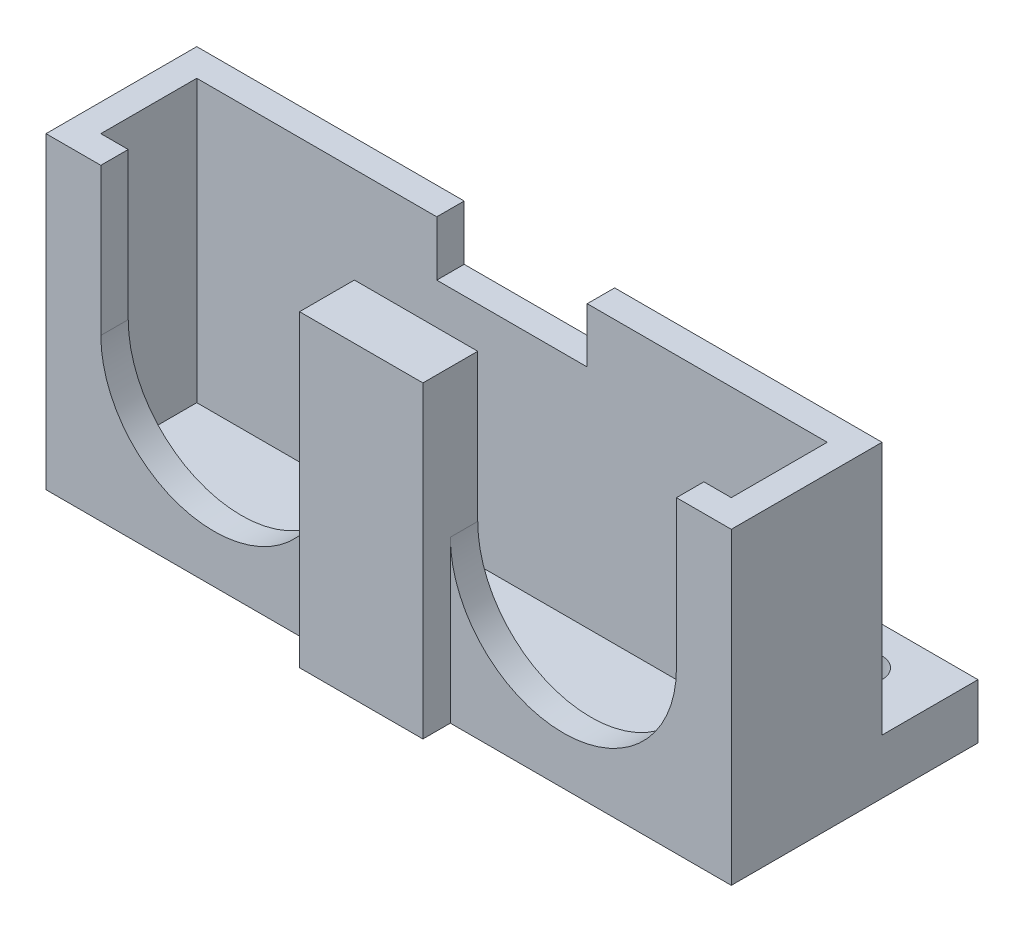
ISO-10303-21;
HEADER;
FILE_DESCRIPTION(('STEP AP214'),'2;1');
FILE_NAME('part.step','',(''),(''),'','','');
FILE_SCHEMA(('AUTOMOTIVE_DESIGN { 1 0 10303 214 1 1 1 1 }'));
ENDSEC;
DATA;
#1=APPLICATION_CONTEXT('core data for automotive mechanical design processes');
#2=APPLICATION_PROTOCOL_DEFINITION('international standard','automotive_design',2000,#1);
#3=PRODUCT_CONTEXT('',#1,'mechanical');
#4=PRODUCT('Part','Part','',(#3));
#5=PRODUCT_RELATED_PRODUCT_CATEGORY('part','',(#4));
#6=PRODUCT_DEFINITION_FORMATION('','',#4);
#7=PRODUCT_DEFINITION_CONTEXT('part definition',#1,'design');
#8=PRODUCT_DEFINITION('design','',#6,#7);
#9=PRODUCT_DEFINITION_SHAPE('','',#8);
#10=(LENGTH_UNIT() NAMED_UNIT(*) SI_UNIT(.MILLI.,.METRE.));
#11=(NAMED_UNIT(*) PLANE_ANGLE_UNIT() SI_UNIT($,.RADIAN.));
#12=(NAMED_UNIT(*) SI_UNIT($,.STERADIAN.) SOLID_ANGLE_UNIT());
#13=UNCERTAINTY_MEASURE_WITH_UNIT(LENGTH_MEASURE(1.E-05),#10,'distance_accuracy_value','');
#14=(GEOMETRIC_REPRESENTATION_CONTEXT(3) GLOBAL_UNCERTAINTY_ASSIGNED_CONTEXT((#13)) GLOBAL_UNIT_ASSIGNED_CONTEXT((#10,
#11,#12)) REPRESENTATION_CONTEXT('',''));
#15=CARTESIAN_POINT('',(0.,0.,0.));
#16=DIRECTION('',(0.,0.,1.));
#17=DIRECTION('',(1.,0.,0.));
#18=AXIS2_PLACEMENT_3D('',#15,#16,#17);
#19=CARTESIAN_POINT('',(-25.,22.5,5.50000000000001));
#20=DIRECTION('',(0.,0.,-1.));
#21=DIRECTION('',(-1.,0.,0.));
#22=AXIS2_PLACEMENT_3D('',#19,#20,#21);
#23=PLANE('',#22);
#24=DIRECTION('',(1.,0.,0.));
#25=VECTOR('',#24,1.);
#26=CARTESIAN_POINT('',(-25.,0.,5.50000000000001));
#27=LINE('',#26,#25);
#28=CARTESIAN_POINT('',(-25.,0.,5.50000000000001));
#29=VERTEX_POINT('',#28);
#30=CARTESIAN_POINT('',(-4.50000000000001,0.,5.50000000000001));
#31=VERTEX_POINT('',#30);
#32=EDGE_CURVE('E422',#29,#31,#27,.T.);
#33=ORIENTED_EDGE('',*,*,#32,.T.);
#34=DIRECTION('',(0.,1.,0.));
#35=VECTOR('',#34,1.);
#36=CARTESIAN_POINT('',(-4.50000000000002,22.5,5.50000000000001));
#37=LINE('',#36,#35);
#38=CARTESIAN_POINT('',(-4.50000000000002,11.75,5.50000000000001));
#39=VERTEX_POINT('',#38);
#40=EDGE_CURVE('E216',#31,#39,#37,.T.);
#41=ORIENTED_EDGE('',*,*,#40,.T.);
#42=CARTESIAN_POINT('',(-12.75,11.75,5.50000000000001));
#43=DIRECTION('',(0.,0.,1.));
#44=DIRECTION('',(1.,0.,0.));
#45=AXIS2_PLACEMENT_3D('',#42,#43,#44);
#46=CIRCLE('',#45,8.25);
#47=CARTESIAN_POINT('',(-21.,11.75,5.50000000000001));
#48=VERTEX_POINT('',#47);
#49=EDGE_CURVE('E345',#48,#39,#46,.T.);
#50=ORIENTED_EDGE('',*,*,#49,.F.);
#51=DIRECTION('',(0.,-1.,0.));
#52=VECTOR('',#51,1.);
#53=CARTESIAN_POINT('',(-21.,22.5,5.50000000000001));
#54=LINE('',#53,#52);
#55=CARTESIAN_POINT('',(-21.,22.5,5.50000000000001));
#56=VERTEX_POINT('',#55);
#57=EDGE_CURVE('E339',#56,#48,#54,.T.);
#58=ORIENTED_EDGE('',*,*,#57,.F.);
#59=DIRECTION('',(1.,0.,0.));
#60=VECTOR('',#59,1.);
#61=CARTESIAN_POINT('',(-25.,22.5,5.50000000000001));
#62=LINE('',#61,#60);
#63=CARTESIAN_POINT('',(-25.,22.5,5.50000000000001));
#64=VERTEX_POINT('',#63);
#65=EDGE_CURVE('E429',#64,#56,#62,.T.);
#66=ORIENTED_EDGE('',*,*,#65,.F.);
#67=DIRECTION('',(0.,-1.,0.));
#68=VECTOR('',#67,1.);
#69=CARTESIAN_POINT('',(-25.,22.5,5.50000000000001));
#70=LINE('',#69,#68);
#71=EDGE_CURVE('E440',#64,#29,#70,.T.);
#72=ORIENTED_EDGE('',*,*,#71,.T.);
#73=EDGE_LOOP('',(#33,#41,#50,#58,#66,#72));
#74=FACE_BOUND('',#73,.T.);
#75=ADVANCED_FACE('F46',(#74),#23,.F.);
#76=CARTESIAN_POINT('',(-25.,22.5,-5.5));
#77=DIRECTION('',(0.,0.,1.));
#78=DIRECTION('',(1.,0.,0.));
#79=AXIS2_PLACEMENT_3D('',#76,#77,#78);
#80=PLANE('',#79);
#81=DIRECTION('',(1.,0.,0.));
#82=VECTOR('',#81,1.);
#83=CARTESIAN_POINT('',(25.,4.,-5.50000000000001));
#84=LINE('',#83,#82);
#85=CARTESIAN_POINT('',(-25.,4.00000000000001,-5.5));
#86=VERTEX_POINT('',#85);
#87=CARTESIAN_POINT('',(25.,4.,-5.50000000000001));
#88=VERTEX_POINT('',#87);
#89=EDGE_CURVE('E63',#86,#88,#84,.T.);
#90=ORIENTED_EDGE('',*,*,#89,.F.);
#91=DIRECTION('',(0.,-1.,0.));
#92=VECTOR('',#91,1.);
#93=CARTESIAN_POINT('',(-25.,22.5,-5.5));
#94=LINE('',#93,#92);
#95=CARTESIAN_POINT('',(-25.,22.5,-5.5));
#96=VERTEX_POINT('',#95);
#97=EDGE_CURVE('E317',#96,#86,#94,.T.);
#98=ORIENTED_EDGE('',*,*,#97,.F.);
#99=DIRECTION('',(-1.,0.,0.));
#100=VECTOR('',#99,1.);
#101=CARTESIAN_POINT('',(-25.,22.5,-5.5));
#102=LINE('',#101,#100);
#103=CARTESIAN_POINT('',(-5.48958028460994,22.5,-5.5));
#104=VERTEX_POINT('',#103);
#105=EDGE_CURVE('E421',#104,#96,#102,.T.);
#106=ORIENTED_EDGE('',*,*,#105,.F.);
#107=DIRECTION('',(0.,1.,0.));
#108=VECTOR('',#107,1.);
#109=CARTESIAN_POINT('',(-5.48958028460994,18.5,-5.5));
#110=LINE('',#109,#108);
#111=CARTESIAN_POINT('',(-5.48958028460994,18.5,-5.5));
#112=VERTEX_POINT('',#111);
#113=EDGE_CURVE('E378',#112,#104,#110,.T.);
#114=ORIENTED_EDGE('',*,*,#113,.F.);
#115=DIRECTION('',(-1.,0.,0.));
#116=VECTOR('',#115,1.);
#117=CARTESIAN_POINT('',(-5.48958028460994,18.5,-5.5));
#118=LINE('',#117,#116);
#119=CARTESIAN_POINT('',(5.48958028460994,18.5,-5.5));
#120=VERTEX_POINT('',#119);
#121=EDGE_CURVE('E360',#120,#112,#118,.T.);
#122=ORIENTED_EDGE('',*,*,#121,.F.);
#123=DIRECTION('',(0.,1.,0.));
#124=VECTOR('',#123,1.);
#125=CARTESIAN_POINT('',(5.48958028460994,18.5,-5.5));
#126=LINE('',#125,#124);
#127=CARTESIAN_POINT('',(5.48958028460994,22.5,-5.5));
#128=VERTEX_POINT('',#127);
#129=EDGE_CURVE('E369',#120,#128,#126,.T.);
#130=ORIENTED_EDGE('',*,*,#129,.T.);
#131=CARTESIAN_POINT('',(25.,22.5,-5.50000000000001));
#132=VERTEX_POINT('',#131);
#133=EDGE_CURVE('E423',#132,#128,#102,.T.);
#134=ORIENTED_EDGE('',*,*,#133,.F.);
#135=DIRECTION('',(0.,-1.,0.));
#136=VECTOR('',#135,1.);
#137=CARTESIAN_POINT('',(25.,22.5,-5.50000000000001));
#138=LINE('',#137,#136);
#139=EDGE_CURVE('E448',#132,#88,#138,.T.);
#140=ORIENTED_EDGE('',*,*,#139,.T.);
#141=EDGE_LOOP('',(#90,#98,#106,#114,#122,#130,#134,#140));
#142=FACE_BOUND('',#141,.T.);
#143=ADVANCED_FACE('F539',(#142),#80,.F.);
#144=CARTESIAN_POINT('',(0.,22.5,0.));
#145=DIRECTION('',(0.,1.,0.));
#146=DIRECTION('',(0.,0.,1.));
#147=AXIS2_PLACEMENT_3D('',#144,#145,#146);
#148=PLANE('',#147);
#149=DIRECTION('',(0.,0.,1.));
#150=VECTOR('',#149,1.);
#151=CARTESIAN_POINT('',(4.49999999999999,22.5,1.5));
#152=LINE('',#151,#150);
#153=CARTESIAN_POINT('',(4.49999999999999,22.5,3.5));
#154=VERTEX_POINT('',#153);
#155=CARTESIAN_POINT('',(4.49999999999999,22.5,7.5));
#156=VERTEX_POINT('',#155);
#157=EDGE_CURVE('E337',#154,#156,#152,.T.);
#158=ORIENTED_EDGE('',*,*,#157,.F.);
#159=DIRECTION('',(1.,0.,0.));
#160=VECTOR('',#159,1.);
#161=CARTESIAN_POINT('',(-23.,22.5,3.5));
#162=LINE('',#161,#160);
#163=CARTESIAN_POINT('',(-4.50000000000001,22.5,3.5));
#164=VERTEX_POINT('',#163);
#165=EDGE_CURVE('E406',#164,#154,#162,.T.);
#166=ORIENTED_EDGE('',*,*,#165,.F.);
#167=DIRECTION('',(0.,0.,1.));
#168=VECTOR('',#167,1.);
#169=CARTESIAN_POINT('',(-4.50000000000001,22.5,1.5));
#170=LINE('',#169,#168);
#171=CARTESIAN_POINT('',(-4.50000000000001,22.5,7.5));
#172=VERTEX_POINT('',#171);
#173=EDGE_CURVE('E352',#164,#172,#170,.T.);
#174=ORIENTED_EDGE('',*,*,#173,.T.);
#175=DIRECTION('',(1.,0.,0.));
#176=VECTOR('',#175,1.);
#177=CARTESIAN_POINT('',(-4.50000000000001,22.5,7.5));
#178=LINE('',#177,#176);
#179=EDGE_CURVE('E222',#172,#156,#178,.T.);
#180=ORIENTED_EDGE('',*,*,#179,.T.);
#181=EDGE_LOOP('',(#158,#166,#174,#180));
#182=FACE_BOUND('',#181,.T.);
#183=ADVANCED_FACE('F478',(#182),#148,.T.);
#184=DIRECTION('',(0.,0.,1.));
#185=VECTOR('',#184,1.);
#186=CARTESIAN_POINT('',(-21.,22.5,1.5));
#187=LINE('',#186,#185);
#188=CARTESIAN_POINT('',(-21.,22.5,3.5));
#189=VERTEX_POINT('',#188);
#190=EDGE_CURVE('E349',#189,#56,#187,.T.);
#191=ORIENTED_EDGE('',*,*,#190,.F.);
#192=CARTESIAN_POINT('',(-23.,22.5,3.5));
#193=VERTEX_POINT('',#192);
#194=EDGE_CURVE('E386',#193,#189,#162,.T.);
#195=ORIENTED_EDGE('',*,*,#194,.F.);
#196=DIRECTION('',(0.,0.,1.));
#197=VECTOR('',#196,1.);
#198=CARTESIAN_POINT('',(-23.,22.5,-3.5));
#199=LINE('',#198,#197);
#200=CARTESIAN_POINT('',(-23.,22.5,-3.5));
#201=VERTEX_POINT('',#200);
#202=EDGE_CURVE('E400',#201,#193,#199,.T.);
#203=ORIENTED_EDGE('',*,*,#202,.F.);
#204=DIRECTION('',(-1.,0.,0.));
#205=VECTOR('',#204,1.);
#206=CARTESIAN_POINT('',(-23.,22.5,-3.5));
#207=LINE('',#206,#205);
#208=CARTESIAN_POINT('',(-5.48958028460994,22.5,-3.5));
#209=VERTEX_POINT('',#208);
#210=EDGE_CURVE('E396',#209,#201,#207,.T.);
#211=ORIENTED_EDGE('',*,*,#210,.F.);
#212=DIRECTION('',(0.,0.,1.));
#213=VECTOR('',#212,1.);
#214=CARTESIAN_POINT('',(-5.48958028460994,22.5,-5.5));
#215=LINE('',#214,#213);
#216=EDGE_CURVE('E361',#104,#209,#215,.T.);
#217=ORIENTED_EDGE('',*,*,#216,.F.);
#218=ORIENTED_EDGE('',*,*,#105,.T.);
#219=DIRECTION('',(0.,0.,1.));
#220=VECTOR('',#219,1.);
#221=CARTESIAN_POINT('',(-25.,22.5,-5.5));
#222=LINE('',#221,#220);
#223=EDGE_CURVE('E426',#96,#64,#222,.T.);
#224=ORIENTED_EDGE('',*,*,#223,.T.);
#225=ORIENTED_EDGE('',*,*,#65,.T.);
#226=EDGE_LOOP('',(#191,#195,#203,#211,#217,#218,#224,#225));
#227=FACE_BOUND('',#226,.T.);
#228=ADVANCED_FACE('F503',(#227),#148,.T.);
#229=CARTESIAN_POINT('',(25.,22.5,-5.50000000000001));
#230=DIRECTION('',(-1.,0.,0.));
#231=DIRECTION('',(0.,0.,1.));
#232=AXIS2_PLACEMENT_3D('',#229,#230,#231);
#233=PLANE('',#232);
#234=DIRECTION('',(0.,0.,-1.));
#235=VECTOR('',#234,1.);
#236=CARTESIAN_POINT('',(25.,0.,-5.50000000000001));
#237=LINE('',#236,#235);
#238=CARTESIAN_POINT('',(25.,0.,5.50000000000001));
#239=VERTEX_POINT('',#238);
#240=CARTESIAN_POINT('',(25.,0.,-12.5));
#241=VERTEX_POINT('',#240);
#242=EDGE_CURVE('E410',#239,#241,#237,.T.);
#243=ORIENTED_EDGE('',*,*,#242,.T.);
#244=DIRECTION('',(0.,-1.,0.));
#245=VECTOR('',#244,1.);
#246=CARTESIAN_POINT('',(25.,0.,-12.5));
#247=LINE('',#246,#245);
#248=CARTESIAN_POINT('',(25.,4.,-12.5));
#249=VERTEX_POINT('',#248);
#250=EDGE_CURVE('E299',#249,#241,#247,.T.);
#251=ORIENTED_EDGE('',*,*,#250,.F.);
#252=DIRECTION('',(0.,0.,1.));
#253=VECTOR('',#252,1.);
#254=CARTESIAN_POINT('',(25.,4.,-12.5));
#255=LINE('',#254,#253);
#256=EDGE_CURVE('E309',#249,#88,#255,.T.);
#257=ORIENTED_EDGE('',*,*,#256,.T.);
#258=ORIENTED_EDGE('',*,*,#139,.F.);
#259=DIRECTION('',(0.,0.,-1.));
#260=VECTOR('',#259,1.);
#261=CARTESIAN_POINT('',(25.,22.5,-5.50000000000001));
#262=LINE('',#261,#260);
#263=CARTESIAN_POINT('',(25.,22.5,5.50000000000001));
#264=VERTEX_POINT('',#263);
#265=EDGE_CURVE('E418',#264,#132,#262,.T.);
#266=ORIENTED_EDGE('',*,*,#265,.F.);
#267=DIRECTION('',(0.,-1.,0.));
#268=VECTOR('',#267,1.);
#269=CARTESIAN_POINT('',(25.,22.5,5.50000000000001));
#270=LINE('',#269,#268);
#271=EDGE_CURVE('E432',#264,#239,#270,.T.);
#272=ORIENTED_EDGE('',*,*,#271,.T.);
#273=EDGE_LOOP('',(#243,#251,#257,#258,#266,#272));
#274=FACE_BOUND('',#273,.T.);
#275=ADVANCED_FACE('F48',(#274),#233,.F.);
#276=CARTESIAN_POINT('',(-25.,22.5,-5.5));
#277=DIRECTION('',(1.,0.,0.));
#278=DIRECTION('',(0.,0.,-1.));
#279=AXIS2_PLACEMENT_3D('',#276,#277,#278);
#280=PLANE('',#279);
#281=DIRECTION('',(0.,0.,1.));
#282=VECTOR('',#281,1.);
#283=CARTESIAN_POINT('',(-25.,0.,-5.5));
#284=LINE('',#283,#282);
#285=CARTESIAN_POINT('',(-25.,0.,-12.5));
#286=VERTEX_POINT('',#285);
#287=EDGE_CURVE('E434',#286,#29,#284,.T.);
#288=ORIENTED_EDGE('',*,*,#287,.T.);
#289=ORIENTED_EDGE('',*,*,#71,.F.);
#290=ORIENTED_EDGE('',*,*,#223,.F.);
#291=ORIENTED_EDGE('',*,*,#97,.T.);
#292=DIRECTION('',(0.,0.,1.));
#293=VECTOR('',#292,1.);
#294=CARTESIAN_POINT('',(-25.,4.,-12.5));
#295=LINE('',#294,#293);
#296=CARTESIAN_POINT('',(-25.,4.,-12.5));
#297=VERTEX_POINT('',#296);
#298=EDGE_CURVE('E322',#297,#86,#295,.T.);
#299=ORIENTED_EDGE('',*,*,#298,.F.);
#300=DIRECTION('',(0.,1.,0.));
#301=VECTOR('',#300,1.);
#302=CARTESIAN_POINT('',(-25.,0.,-12.5));
#303=LINE('',#302,#301);
#304=EDGE_CURVE('E305',#286,#297,#303,.T.);
#305=ORIENTED_EDGE('',*,*,#304,.F.);
#306=EDGE_LOOP('',(#288,#289,#290,#291,#299,#305));
#307=FACE_BOUND('',#306,.T.);
#308=ADVANCED_FACE('F513',(#307),#280,.F.);
#309=CARTESIAN_POINT('',(12.75,11.75,5.50000000000001));
#310=DIRECTION('',(0.,0.,1.));
#311=DIRECTION('',(1.,0.,0.));
#312=AXIS2_PLACEMENT_3D('',#309,#310,#311);
#313=CIRCLE('',#312,8.25);
#314=CARTESIAN_POINT('',(4.49999999999999,11.75,5.50000000000001));
#315=VERTEX_POINT('',#314);
#316=CARTESIAN_POINT('',(21.,11.75,5.50000000000001));
#317=VERTEX_POINT('',#316);
#318=EDGE_CURVE('E312',#315,#317,#313,.T.);
#319=ORIENTED_EDGE('',*,*,#318,.F.);
#320=DIRECTION('',(0.,-1.,0.));
#321=VECTOR('',#320,1.);
#322=CARTESIAN_POINT('',(4.49999999999999,22.5,5.50000000000001));
#323=LINE('',#322,#321);
#324=CARTESIAN_POINT('',(4.49999999999999,0.,5.50000000000001));
#325=VERTEX_POINT('',#324);
#326=EDGE_CURVE('E240',#315,#325,#323,.T.);
#327=ORIENTED_EDGE('',*,*,#326,.T.);
#328=EDGE_CURVE('E436',#325,#239,#27,.T.);
#329=ORIENTED_EDGE('',*,*,#328,.T.);
#330=ORIENTED_EDGE('',*,*,#271,.F.);
#331=CARTESIAN_POINT('',(21.,22.5,5.50000000000001));
#332=VERTEX_POINT('',#331);
#333=EDGE_CURVE('E428',#332,#264,#62,.T.);
#334=ORIENTED_EDGE('',*,*,#333,.F.);
#335=DIRECTION('',(0.,1.,0.));
#336=VECTOR('',#335,1.);
#337=CARTESIAN_POINT('',(21.,22.5,5.50000000000001));
#338=LINE('',#337,#336);
#339=EDGE_CURVE('E328',#317,#332,#338,.T.);
#340=ORIENTED_EDGE('',*,*,#339,.F.);
#341=EDGE_LOOP('',(#319,#327,#329,#330,#334,#340));
#342=FACE_BOUND('',#341,.T.);
#343=ADVANCED_FACE('F521',(#342),#23,.F.);
#344=DIRECTION('',(0.,0.,1.));
#345=VECTOR('',#344,1.);
#346=CARTESIAN_POINT('',(21.,22.5,1.5));
#347=LINE('',#346,#345);
#348=CARTESIAN_POINT('',(21.,22.5,3.5));
#349=VERTEX_POINT('',#348);
#350=EDGE_CURVE('E340',#349,#332,#347,.T.);
#351=ORIENTED_EDGE('',*,*,#350,.T.);
#352=ORIENTED_EDGE('',*,*,#333,.T.);
#353=ORIENTED_EDGE('',*,*,#265,.T.);
#354=ORIENTED_EDGE('',*,*,#133,.T.);
#355=DIRECTION('',(0.,0.,-1.));
#356=VECTOR('',#355,1.);
#357=CARTESIAN_POINT('',(5.48958028460994,22.5,-5.5));
#358=LINE('',#357,#356);
#359=CARTESIAN_POINT('',(5.48958028460994,22.5,-3.5));
#360=VERTEX_POINT('',#359);
#361=EDGE_CURVE('E351',#360,#128,#358,.T.);
#362=ORIENTED_EDGE('',*,*,#361,.F.);
#363=CARTESIAN_POINT('',(23.,22.5,-3.5));
#364=VERTEX_POINT('',#363);
#365=EDGE_CURVE('E397',#364,#360,#207,.T.);
#366=ORIENTED_EDGE('',*,*,#365,.F.);
#367=DIRECTION('',(0.,0.,-1.));
#368=VECTOR('',#367,1.);
#369=CARTESIAN_POINT('',(23.,22.5,-3.5));
#370=LINE('',#369,#368);
#371=CARTESIAN_POINT('',(23.,22.5,3.5));
#372=VERTEX_POINT('',#371);
#373=EDGE_CURVE('E374',#372,#364,#370,.T.);
#374=ORIENTED_EDGE('',*,*,#373,.F.);
#375=EDGE_CURVE('E403',#349,#372,#162,.T.);
#376=ORIENTED_EDGE('',*,*,#375,.F.);
#377=EDGE_LOOP('',(#351,#352,#353,#354,#362,#366,#374,#376));
#378=FACE_BOUND('',#377,.T.);
#379=ADVANCED_FACE('F487',(#378),#148,.T.);
#380=CARTESIAN_POINT('',(0.,0.,0.));
#381=DIRECTION('',(0.,1.,0.));
#382=DIRECTION('',(0.,0.,1.));
#383=AXIS2_PLACEMENT_3D('',#380,#381,#382);
#384=PLANE('',#383);
#385=ORIENTED_EDGE('',*,*,#328,.F.);
#386=DIRECTION('',(0.,0.,-1.));
#387=VECTOR('',#386,1.);
#388=CARTESIAN_POINT('',(4.49999999999999,0.,3.5));
#389=LINE('',#388,#387);
#390=CARTESIAN_POINT('',(4.49999999999999,0.,7.5));
#391=VERTEX_POINT('',#390);
#392=EDGE_CURVE('E230',#391,#325,#389,.T.);
#393=ORIENTED_EDGE('',*,*,#392,.F.);
#394=DIRECTION('',(1.,0.,0.));
#395=VECTOR('',#394,1.);
#396=CARTESIAN_POINT('',(-4.50000000000001,0.,7.5));
#397=LINE('',#396,#395);
#398=CARTESIAN_POINT('',(-4.50000000000001,0.,7.5));
#399=VERTEX_POINT('',#398);
#400=EDGE_CURVE('E221',#399,#391,#397,.T.);
#401=ORIENTED_EDGE('',*,*,#400,.F.);
#402=DIRECTION('',(0.,0.,1.));
#403=VECTOR('',#402,1.);
#404=CARTESIAN_POINT('',(-4.50000000000001,0.,3.5));
#405=LINE('',#404,#403);
#406=EDGE_CURVE('E210',#31,#399,#405,.T.);
#407=ORIENTED_EDGE('',*,*,#406,.F.);
#408=ORIENTED_EDGE('',*,*,#32,.F.);
#409=ORIENTED_EDGE('',*,*,#287,.F.);
#410=DIRECTION('',(-1.,0.,0.));
#411=VECTOR('',#410,1.);
#412=CARTESIAN_POINT('',(25.,0.,-12.5));
#413=LINE('',#412,#411);
#414=EDGE_CURVE('E302',#241,#286,#413,.T.);
#415=ORIENTED_EDGE('',*,*,#414,.F.);
#416=ORIENTED_EDGE('',*,*,#242,.F.);
#417=EDGE_LOOP('',(#385,#393,#401,#407,#408,#409,#415,#416));
#418=FACE_BOUND('',#417,.T.);
#419=CARTESIAN_POINT('',(20.,0.,-9.00000000000001));
#420=DIRECTION('',(0.,1.,0.));
#421=DIRECTION('',(0.,0.,1.));
#422=AXIS2_PLACEMENT_3D('',#419,#420,#421);
#423=CIRCLE('',#422,1.5);
#424=CARTESIAN_POINT('',(20.,0.,-7.5));
#425=VERTEX_POINT('',#424);
#426=EDGE_CURVE('E248',#425,#425,#423,.T.);
#427=ORIENTED_EDGE('',*,*,#426,.T.);
#428=EDGE_LOOP('',(#427));
#429=FACE_BOUND('',#428,.T.);
#430=CARTESIAN_POINT('',(-20.,0.,-9.00000000000001));
#431=DIRECTION('',(0.,1.,0.));
#432=DIRECTION('',(0.,0.,1.));
#433=AXIS2_PLACEMENT_3D('',#430,#431,#432);
#434=CIRCLE('',#433,1.5);
#435=CARTESIAN_POINT('',(-20.,0.,-7.5));
#436=VERTEX_POINT('',#435);
#437=EDGE_CURVE('E254',#436,#436,#434,.T.);
#438=ORIENTED_EDGE('',*,*,#437,.T.);
#439=EDGE_LOOP('',(#438));
#440=FACE_BOUND('',#439,.T.);
#441=CARTESIAN_POINT('',(-15.,0.,-9.00000000000001));
#442=DIRECTION('',(0.,1.,0.));
#443=DIRECTION('',(0.,0.,1.));
#444=AXIS2_PLACEMENT_3D('',#441,#442,#443);
#445=CIRCLE('',#444,1.5);
#446=CARTESIAN_POINT('',(-15.,0.,-7.5));
#447=VERTEX_POINT('',#446);
#448=EDGE_CURVE('E260',#447,#447,#445,.T.);
#449=ORIENTED_EDGE('',*,*,#448,.T.);
#450=EDGE_LOOP('',(#449));
#451=FACE_BOUND('',#450,.T.);
#452=CARTESIAN_POINT('',(-10.,0.,-9.00000000000001));
#453=DIRECTION('',(0.,1.,0.));
#454=DIRECTION('',(0.,0.,1.));
#455=AXIS2_PLACEMENT_3D('',#452,#453,#454);
#456=CIRCLE('',#455,1.5);
#457=CARTESIAN_POINT('',(-10.,0.,-7.50000000000001));
#458=VERTEX_POINT('',#457);
#459=EDGE_CURVE('E266',#458,#458,#456,.T.);
#460=ORIENTED_EDGE('',*,*,#459,.T.);
#461=EDGE_LOOP('',(#460));
#462=FACE_BOUND('',#461,.T.);
#463=CARTESIAN_POINT('',(-5.,0.,-9.00000000000001));
#464=DIRECTION('',(0.,1.,0.));
#465=DIRECTION('',(0.,0.,1.));
#466=AXIS2_PLACEMENT_3D('',#463,#464,#465);
#467=CIRCLE('',#466,1.5);
#468=CARTESIAN_POINT('',(-5.,0.,-7.5));
#469=VERTEX_POINT('',#468);
#470=EDGE_CURVE('E272',#469,#469,#467,.T.);
#471=ORIENTED_EDGE('',*,*,#470,.T.);
#472=EDGE_LOOP('',(#471));
#473=FACE_BOUND('',#472,.T.);
#474=CARTESIAN_POINT('',(0.,0.,-9.00000000000001));
#475=DIRECTION('',(0.,1.,0.));
#476=DIRECTION('',(0.,0.,1.));
#477=AXIS2_PLACEMENT_3D('',#474,#475,#476);
#478=CIRCLE('',#477,1.5);
#479=CARTESIAN_POINT('',(0.,0.,-7.50000000000001));
#480=VERTEX_POINT('',#479);
#481=EDGE_CURVE('E278',#480,#480,#478,.T.);
#482=ORIENTED_EDGE('',*,*,#481,.T.);
#483=EDGE_LOOP('',(#482));
#484=FACE_BOUND('',#483,.T.);
#485=CARTESIAN_POINT('',(5.,0.,-9.00000000000001));
#486=DIRECTION('',(0.,1.,0.));
#487=DIRECTION('',(0.,0.,1.));
#488=AXIS2_PLACEMENT_3D('',#485,#486,#487);
#489=CIRCLE('',#488,1.5);
#490=CARTESIAN_POINT('',(5.,0.,-7.50000000000001));
#491=VERTEX_POINT('',#490);
#492=EDGE_CURVE('E284',#491,#491,#489,.T.);
#493=ORIENTED_EDGE('',*,*,#492,.T.);
#494=EDGE_LOOP('',(#493));
#495=FACE_BOUND('',#494,.T.);
#496=CARTESIAN_POINT('',(10.,0.,-9.00000000000001));
#497=DIRECTION('',(0.,1.,0.));
#498=DIRECTION('',(0.,0.,1.));
#499=AXIS2_PLACEMENT_3D('',#496,#497,#498);
#500=CIRCLE('',#499,1.5);
#501=CARTESIAN_POINT('',(10.,0.,-7.50000000000001));
#502=VERTEX_POINT('',#501);
#503=EDGE_CURVE('E290',#502,#502,#500,.T.);
#504=ORIENTED_EDGE('',*,*,#503,.T.);
#505=EDGE_LOOP('',(#504));
#506=FACE_BOUND('',#505,.T.);
#507=CARTESIAN_POINT('',(15.,0.,-9.00000000000001));
#508=DIRECTION('',(0.,1.,0.));
#509=DIRECTION('',(0.,0.,1.));
#510=AXIS2_PLACEMENT_3D('',#507,#508,#509);
#511=CIRCLE('',#510,1.49999999999999);
#512=CARTESIAN_POINT('',(15.,0.,-7.50000000000001));
#513=VERTEX_POINT('',#512);
#514=EDGE_CURVE('E296',#513,#513,#511,.T.);
#515=ORIENTED_EDGE('',*,*,#514,.T.);
#516=EDGE_LOOP('',(#515));
#517=FACE_BOUND('',#516,.T.);
#518=ADVANCED_FACE('F234',(#418,#429,#440,#451,#462,#473,#484,#495,#506,#517),#384,.F.);
#519=CARTESIAN_POINT('',(23.,2.,-3.5));
#520=DIRECTION('',(1.,0.,0.));
#521=DIRECTION('',(0.,0.,-1.));
#522=AXIS2_PLACEMENT_3D('',#519,#520,#521);
#523=PLANE('',#522);
#524=ORIENTED_EDGE('',*,*,#373,.T.);
#525=DIRECTION('',(0.,1.,0.));
#526=VECTOR('',#525,1.);
#527=CARTESIAN_POINT('',(23.,2.,-3.5));
#528=LINE('',#527,#526);
#529=CARTESIAN_POINT('',(23.,2.,-3.5));
#530=VERTEX_POINT('',#529);
#531=EDGE_CURVE('E394',#530,#364,#528,.T.);
#532=ORIENTED_EDGE('',*,*,#531,.F.);
#533=DIRECTION('',(0.,0.,-1.));
#534=VECTOR('',#533,1.);
#535=CARTESIAN_POINT('',(23.,2.,-3.5));
#536=LINE('',#535,#534);
#537=CARTESIAN_POINT('',(23.,2.,3.5));
#538=VERTEX_POINT('',#537);
#539=EDGE_CURVE('E382',#538,#530,#536,.T.);
#540=ORIENTED_EDGE('',*,*,#539,.F.);
#541=DIRECTION('',(0.,1.,0.));
#542=VECTOR('',#541,1.);
#543=CARTESIAN_POINT('',(23.,2.,3.5));
#544=LINE('',#543,#542);
#545=EDGE_CURVE('E407',#538,#372,#544,.T.);
#546=ORIENTED_EDGE('',*,*,#545,.T.);
#547=EDGE_LOOP('',(#524,#532,#540,#546));
#548=FACE_BOUND('',#547,.T.);
#549=ADVANCED_FACE('F485',(#548),#523,.F.);
#550=CARTESIAN_POINT('',(-23.,2.,3.5));
#551=DIRECTION('',(0.,0.,1.));
#552=DIRECTION('',(1.,0.,0.));
#553=AXIS2_PLACEMENT_3D('',#550,#551,#552);
#554=PLANE('',#553);
#555=ORIENTED_EDGE('',*,*,#545,.F.);
#556=DIRECTION('',(1.,0.,0.));
#557=VECTOR('',#556,1.);
#558=CARTESIAN_POINT('',(-23.,2.,3.5));
#559=LINE('',#558,#557);
#560=CARTESIAN_POINT('',(-23.,2.,3.5));
#561=VERTEX_POINT('',#560);
#562=EDGE_CURVE('E392',#561,#538,#559,.T.);
#563=ORIENTED_EDGE('',*,*,#562,.F.);
#564=DIRECTION('',(0.,1.,0.));
#565=VECTOR('',#564,1.);
#566=CARTESIAN_POINT('',(-23.,2.,3.5));
#567=LINE('',#566,#565);
#568=EDGE_CURVE('E411',#561,#193,#567,.T.);
#569=ORIENTED_EDGE('',*,*,#568,.T.);
#570=ORIENTED_EDGE('',*,*,#194,.T.);
#571=DIRECTION('',(0.,-1.,0.));
#572=VECTOR('',#571,1.);
#573=CARTESIAN_POINT('',(-21.,2.,3.5));
#574=LINE('',#573,#572);
#575=CARTESIAN_POINT('',(-21.,11.75,3.5));
#576=VERTEX_POINT('',#575);
#577=EDGE_CURVE('E455',#189,#576,#574,.T.);
#578=ORIENTED_EDGE('',*,*,#577,.T.);
#579=CARTESIAN_POINT('',(-12.75,11.75,3.5));
#580=DIRECTION('',(0.,0.,1.));
#581=DIRECTION('',(1.,0.,0.));
#582=AXIS2_PLACEMENT_3D('',#579,#580,#581);
#583=CIRCLE('',#582,8.25);
#584=CARTESIAN_POINT('',(-4.50000000000001,11.75,3.5));
#585=VERTEX_POINT('',#584);
#586=EDGE_CURVE('E446',#576,#585,#583,.T.);
#587=ORIENTED_EDGE('',*,*,#586,.T.);
#588=DIRECTION('',(0.,1.,0.));
#589=VECTOR('',#588,1.);
#590=CARTESIAN_POINT('',(-4.50000000000001,2.,3.5));
#591=LINE('',#590,#589);
#592=EDGE_CURVE('E457',#585,#164,#591,.T.);
#593=ORIENTED_EDGE('',*,*,#592,.T.);
#594=ORIENTED_EDGE('',*,*,#165,.T.);
#595=DIRECTION('',(0.,-1.,0.));
#596=VECTOR('',#595,1.);
#597=CARTESIAN_POINT('',(4.49999999999999,2.,3.5));
#598=LINE('',#597,#596);
#599=CARTESIAN_POINT('',(4.49999999999999,11.75,3.5));
#600=VERTEX_POINT('',#599);
#601=EDGE_CURVE('E13',#154,#600,#598,.T.);
#602=ORIENTED_EDGE('',*,*,#601,.T.);
#603=CARTESIAN_POINT('',(12.75,11.75,3.5));
#604=DIRECTION('',(0.,0.,1.));
#605=DIRECTION('',(1.,0.,0.));
#606=AXIS2_PLACEMENT_3D('',#603,#604,#605);
#607=CIRCLE('',#606,8.25);
#608=CARTESIAN_POINT('',(21.,11.75,3.5));
#609=VERTEX_POINT('',#608);
#610=EDGE_CURVE('E452',#600,#609,#607,.T.);
#611=ORIENTED_EDGE('',*,*,#610,.T.);
#612=DIRECTION('',(0.,1.,0.));
#613=VECTOR('',#612,1.);
#614=CARTESIAN_POINT('',(21.,2.,3.5));
#615=LINE('',#614,#613);
#616=EDGE_CURVE('E55',#609,#349,#615,.T.);
#617=ORIENTED_EDGE('',*,*,#616,.T.);
#618=ORIENTED_EDGE('',*,*,#375,.T.);
#619=EDGE_LOOP('',(#555,#563,#569,#570,#578,#587,#593,#594,#602,#611,#617,#618));
#620=FACE_BOUND('',#619,.T.);
#621=ADVANCED_FACE('F465',(#620),#554,.F.);
#622=CARTESIAN_POINT('',(-23.,2.,-3.5));
#623=DIRECTION('',(-1.,0.,0.));
#624=DIRECTION('',(0.,0.,1.));
#625=AXIS2_PLACEMENT_3D('',#622,#623,#624);
#626=PLANE('',#625);
#627=ORIENTED_EDGE('',*,*,#202,.T.);
#628=ORIENTED_EDGE('',*,*,#568,.F.);
#629=DIRECTION('',(0.,0.,1.));
#630=VECTOR('',#629,1.);
#631=CARTESIAN_POINT('',(-23.,2.,-3.5));
#632=LINE('',#631,#630);
#633=CARTESIAN_POINT('',(-23.,2.,-3.5));
#634=VERTEX_POINT('',#633);
#635=EDGE_CURVE('E389',#634,#561,#632,.T.);
#636=ORIENTED_EDGE('',*,*,#635,.F.);
#637=DIRECTION('',(0.,1.,0.));
#638=VECTOR('',#637,1.);
#639=CARTESIAN_POINT('',(-23.,2.,-3.5));
#640=LINE('',#639,#638);
#641=EDGE_CURVE('E413',#634,#201,#640,.T.);
#642=ORIENTED_EDGE('',*,*,#641,.T.);
#643=EDGE_LOOP('',(#627,#628,#636,#642));
#644=FACE_BOUND('',#643,.T.);
#645=ADVANCED_FACE('F500',(#644),#626,.F.);
#646=CARTESIAN_POINT('',(-23.,2.,-3.5));
#647=DIRECTION('',(0.,0.,-1.));
#648=DIRECTION('',(-1.,0.,0.));
#649=AXIS2_PLACEMENT_3D('',#646,#647,#648);
#650=PLANE('',#649);
#651=ORIENTED_EDGE('',*,*,#365,.T.);
#652=DIRECTION('',(0.,1.,0.));
#653=VECTOR('',#652,1.);
#654=CARTESIAN_POINT('',(5.48958028460994,18.5,-3.5));
#655=LINE('',#654,#653);
#656=CARTESIAN_POINT('',(5.48958028460994,18.5,-3.5));
#657=VERTEX_POINT('',#656);
#658=EDGE_CURVE('E372',#657,#360,#655,.T.);
#659=ORIENTED_EDGE('',*,*,#658,.F.);
#660=DIRECTION('',(1.,0.,0.));
#661=VECTOR('',#660,1.);
#662=CARTESIAN_POINT('',(-5.48958028460994,18.5,-3.5));
#663=LINE('',#662,#661);
#664=CARTESIAN_POINT('',(-5.48958028460994,18.5,-3.5));
#665=VERTEX_POINT('',#664);
#666=EDGE_CURVE('E366',#665,#657,#663,.T.);
#667=ORIENTED_EDGE('',*,*,#666,.F.);
#668=DIRECTION('',(0.,1.,0.));
#669=VECTOR('',#668,1.);
#670=CARTESIAN_POINT('',(-5.48958028460994,18.5,-3.5));
#671=LINE('',#670,#669);
#672=EDGE_CURVE('E375',#665,#209,#671,.T.);
#673=ORIENTED_EDGE('',*,*,#672,.T.);
#674=ORIENTED_EDGE('',*,*,#210,.T.);
#675=ORIENTED_EDGE('',*,*,#641,.F.);
#676=DIRECTION('',(-1.,0.,0.));
#677=VECTOR('',#676,1.);
#678=CARTESIAN_POINT('',(-23.,2.,-3.5));
#679=LINE('',#678,#677);
#680=EDGE_CURVE('E385',#530,#634,#679,.T.);
#681=ORIENTED_EDGE('',*,*,#680,.F.);
#682=ORIENTED_EDGE('',*,*,#531,.T.);
#683=EDGE_LOOP('',(#651,#659,#667,#673,#674,#675,#681,#682));
#684=FACE_BOUND('',#683,.T.);
#685=ADVANCED_FACE('F491',(#684),#650,.F.);
#686=CARTESIAN_POINT('',(0.,2.,0.));
#687=DIRECTION('',(0.,1.,0.));
#688=DIRECTION('',(0.,0.,1.));
#689=AXIS2_PLACEMENT_3D('',#686,#687,#688);
#690=PLANE('',#689);
#691=ORIENTED_EDGE('',*,*,#539,.T.);
#692=ORIENTED_EDGE('',*,*,#680,.T.);
#693=ORIENTED_EDGE('',*,*,#635,.T.);
#694=ORIENTED_EDGE('',*,*,#562,.T.);
#695=EDGE_LOOP('',(#691,#692,#693,#694));
#696=FACE_BOUND('',#695,.T.);
#697=ADVANCED_FACE('F496',(#696),#690,.T.);
#698=CARTESIAN_POINT('',(5.48958028460994,18.5,-5.5));
#699=DIRECTION('',(1.,0.,0.));
#700=DIRECTION('',(0.,0.,-1.));
#701=AXIS2_PLACEMENT_3D('',#698,#699,#700);
#702=PLANE('',#701);
#703=ORIENTED_EDGE('',*,*,#361,.T.);
#704=ORIENTED_EDGE('',*,*,#129,.F.);
#705=DIRECTION('',(0.,0.,-1.));
#706=VECTOR('',#705,1.);
#707=CARTESIAN_POINT('',(5.48958028460994,18.5,-5.5));
#708=LINE('',#707,#706);
#709=EDGE_CURVE('E357',#657,#120,#708,.T.);
#710=ORIENTED_EDGE('',*,*,#709,.F.);
#711=ORIENTED_EDGE('',*,*,#658,.T.);
#712=EDGE_LOOP('',(#703,#704,#710,#711));
#713=FACE_BOUND('',#712,.T.);
#714=ADVANCED_FACE('F581',(#713),#702,.F.);
#715=CARTESIAN_POINT('',(-5.48958028460994,18.5,-5.5));
#716=DIRECTION('',(-1.,0.,0.));
#717=DIRECTION('',(0.,0.,1.));
#718=AXIS2_PLACEMENT_3D('',#715,#716,#717);
#719=PLANE('',#718);
#720=ORIENTED_EDGE('',*,*,#216,.T.);
#721=ORIENTED_EDGE('',*,*,#672,.F.);
#722=DIRECTION('',(0.,0.,1.));
#723=VECTOR('',#722,1.);
#724=CARTESIAN_POINT('',(-5.48958028460994,18.5,-5.5));
#725=LINE('',#724,#723);
#726=EDGE_CURVE('E364',#112,#665,#725,.T.);
#727=ORIENTED_EDGE('',*,*,#726,.F.);
#728=ORIENTED_EDGE('',*,*,#113,.T.);
#729=EDGE_LOOP('',(#720,#721,#727,#728));
#730=FACE_BOUND('',#729,.T.);
#731=ADVANCED_FACE('F585',(#730),#719,.F.);
#732=CARTESIAN_POINT('',(0.,18.5,0.));
#733=DIRECTION('',(0.,1.,0.));
#734=DIRECTION('',(0.,0.,1.));
#735=AXIS2_PLACEMENT_3D('',#732,#733,#734);
#736=PLANE('',#735);
#737=ORIENTED_EDGE('',*,*,#709,.T.);
#738=ORIENTED_EDGE('',*,*,#121,.T.);
#739=ORIENTED_EDGE('',*,*,#726,.T.);
#740=ORIENTED_EDGE('',*,*,#666,.T.);
#741=EDGE_LOOP('',(#737,#738,#739,#740));
#742=FACE_BOUND('',#741,.T.);
#743=ADVANCED_FACE('F590',(#742),#736,.T.);
#744=CARTESIAN_POINT('',(-21.,22.5,1.5));
#745=DIRECTION('',(-1.,0.,0.));
#746=DIRECTION('',(0.,-1.,0.));
#747=AXIS2_PLACEMENT_3D('',#744,#745,#746);
#748=PLANE('',#747);
#749=ORIENTED_EDGE('',*,*,#190,.T.);
#750=ORIENTED_EDGE('',*,*,#57,.T.);
#751=DIRECTION('',(0.,0.,1.));
#752=VECTOR('',#751,1.);
#753=CARTESIAN_POINT('',(-21.,11.75,1.5));
#754=LINE('',#753,#752);
#755=EDGE_CURVE('E348',#576,#48,#754,.T.);
#756=ORIENTED_EDGE('',*,*,#755,.F.);
#757=ORIENTED_EDGE('',*,*,#577,.F.);
#758=EDGE_LOOP('',(#749,#750,#756,#757));
#759=FACE_BOUND('',#758,.T.);
#760=ADVANCED_FACE('F470',(#759),#748,.F.);
#761=CARTESIAN_POINT('',(-4.50000000000001,22.5,1.5));
#762=DIRECTION('',(1.,0.,0.));
#763=DIRECTION('',(0.,0.,-1.));
#764=AXIS2_PLACEMENT_3D('',#761,#762,#763);
#765=PLANE('',#764);
#766=DIRECTION('',(0.,0.,1.));
#767=VECTOR('',#766,1.);
#768=CARTESIAN_POINT('',(-4.50000000000001,11.75,1.5));
#769=LINE('',#768,#767);
#770=EDGE_CURVE('E354',#585,#39,#769,.T.);
#771=ORIENTED_EDGE('',*,*,#770,.T.);
#772=ORIENTED_EDGE('',*,*,#40,.F.);
#773=ORIENTED_EDGE('',*,*,#406,.T.);
#774=DIRECTION('',(0.,1.,0.));
#775=VECTOR('',#774,1.);
#776=CARTESIAN_POINT('',(-4.50000000000001,0.,7.5));
#777=LINE('',#776,#775);
#778=EDGE_CURVE('E214',#399,#172,#777,.T.);
#779=ORIENTED_EDGE('',*,*,#778,.T.);
#780=ORIENTED_EDGE('',*,*,#173,.F.);
#781=ORIENTED_EDGE('',*,*,#592,.F.);
#782=EDGE_LOOP('',(#771,#772,#773,#779,#780,#781));
#783=FACE_BOUND('',#782,.T.);
#784=ADVANCED_FACE('F213',(#783),#765,.F.);
#785=CARTESIAN_POINT('',(-12.75,11.75,1.5));
#786=DIRECTION('',(0.,0.,1.));
#787=DIRECTION('',(1.,0.,0.));
#788=AXIS2_PLACEMENT_3D('',#785,#786,#787);
#789=CYLINDRICAL_SURFACE('',#788,8.25);
#790=ORIENTED_EDGE('',*,*,#755,.T.);
#791=ORIENTED_EDGE('',*,*,#49,.T.);
#792=ORIENTED_EDGE('',*,*,#770,.F.);
#793=ORIENTED_EDGE('',*,*,#586,.F.);
#794=EDGE_LOOP('',(#790,#791,#792,#793));
#795=FACE_BOUND('',#794,.T.);
#796=ADVANCED_FACE('F468',(#795),#789,.F.);
#797=CARTESIAN_POINT('',(4.49999999999999,22.5,1.5));
#798=DIRECTION('',(-1.,0.,0.));
#799=DIRECTION('',(0.,-1.,0.));
#800=AXIS2_PLACEMENT_3D('',#797,#798,#799);
#801=PLANE('',#800);
#802=ORIENTED_EDGE('',*,*,#157,.T.);
#803=DIRECTION('',(0.,1.,0.));
#804=VECTOR('',#803,1.);
#805=CARTESIAN_POINT('',(4.49999999999999,0.,7.5));
#806=LINE('',#805,#804);
#807=EDGE_CURVE('E229',#391,#156,#806,.T.);
#808=ORIENTED_EDGE('',*,*,#807,.F.);
#809=ORIENTED_EDGE('',*,*,#392,.T.);
#810=ORIENTED_EDGE('',*,*,#326,.F.);
#811=DIRECTION('',(0.,0.,1.));
#812=VECTOR('',#811,1.);
#813=CARTESIAN_POINT('',(4.49999999999999,11.75,1.5));
#814=LINE('',#813,#812);
#815=EDGE_CURVE('E332',#600,#315,#814,.T.);
#816=ORIENTED_EDGE('',*,*,#815,.F.);
#817=ORIENTED_EDGE('',*,*,#601,.F.);
#818=EDGE_LOOP('',(#802,#808,#809,#810,#816,#817));
#819=FACE_BOUND('',#818,.T.);
#820=ADVANCED_FACE('F525',(#819),#801,.F.);
#821=CARTESIAN_POINT('',(21.,22.5,1.5));
#822=DIRECTION('',(1.,0.,0.));
#823=DIRECTION('',(0.,0.,-1.));
#824=AXIS2_PLACEMENT_3D('',#821,#822,#823);
#825=PLANE('',#824);
#826=DIRECTION('',(0.,0.,1.));
#827=VECTOR('',#826,1.);
#828=CARTESIAN_POINT('',(21.,11.75,1.5));
#829=LINE('',#828,#827);
#830=EDGE_CURVE('E71',#609,#317,#829,.T.);
#831=ORIENTED_EDGE('',*,*,#830,.T.);
#832=ORIENTED_EDGE('',*,*,#339,.T.);
#833=ORIENTED_EDGE('',*,*,#350,.F.);
#834=ORIENTED_EDGE('',*,*,#616,.F.);
#835=EDGE_LOOP('',(#831,#832,#833,#834));
#836=FACE_BOUND('',#835,.T.);
#837=ADVANCED_FACE('F528',(#836),#825,.F.);
#838=CARTESIAN_POINT('',(12.75,11.75,1.5));
#839=DIRECTION('',(0.,0.,1.));
#840=DIRECTION('',(1.,0.,0.));
#841=AXIS2_PLACEMENT_3D('',#838,#839,#840);
#842=CYLINDRICAL_SURFACE('',#841,8.25);
#843=ORIENTED_EDGE('',*,*,#815,.T.);
#844=ORIENTED_EDGE('',*,*,#318,.T.);
#845=ORIENTED_EDGE('',*,*,#830,.F.);
#846=ORIENTED_EDGE('',*,*,#610,.F.);
#847=EDGE_LOOP('',(#843,#844,#845,#846));
#848=FACE_BOUND('',#847,.T.);
#849=ADVANCED_FACE('F526',(#848),#842,.F.);
#850=CARTESIAN_POINT('',(25.,4.,-12.5));
#851=DIRECTION('',(0.,-1.,0.));
#852=DIRECTION('',(0.,0.,-1.));
#853=AXIS2_PLACEMENT_3D('',#850,#851,#852);
#854=PLANE('',#853);
#855=CARTESIAN_POINT('',(20.,4.,-9.00000000000001));
#856=DIRECTION('',(0.,1.,0.));
#857=DIRECTION('',(0.,0.,1.));
#858=AXIS2_PLACEMENT_3D('',#855,#856,#857);
#859=CIRCLE('',#858,1.5);
#860=CARTESIAN_POINT('',(20.,4.,-7.5));
#861=VERTEX_POINT('',#860);
#862=EDGE_CURVE('E245',#861,#861,#859,.T.);
#863=ORIENTED_EDGE('',*,*,#862,.F.);
#864=EDGE_LOOP('',(#863));
#865=FACE_BOUND('',#864,.T.);
#866=CARTESIAN_POINT('',(-20.,4.,-9.00000000000001));
#867=DIRECTION('',(0.,1.,0.));
#868=DIRECTION('',(0.,0.,1.));
#869=AXIS2_PLACEMENT_3D('',#866,#867,#868);
#870=CIRCLE('',#869,1.5);
#871=CARTESIAN_POINT('',(-20.,4.,-7.5));
#872=VERTEX_POINT('',#871);
#873=EDGE_CURVE('E251',#872,#872,#870,.T.);
#874=ORIENTED_EDGE('',*,*,#873,.F.);
#875=EDGE_LOOP('',(#874));
#876=FACE_BOUND('',#875,.T.);
#877=CARTESIAN_POINT('',(-15.,4.,-9.00000000000001));
#878=DIRECTION('',(0.,1.,0.));
#879=DIRECTION('',(0.,0.,1.));
#880=AXIS2_PLACEMENT_3D('',#877,#878,#879);
#881=CIRCLE('',#880,1.5);
#882=CARTESIAN_POINT('',(-15.,4.,-7.5));
#883=VERTEX_POINT('',#882);
#884=EDGE_CURVE('E257',#883,#883,#881,.T.);
#885=ORIENTED_EDGE('',*,*,#884,.F.);
#886=EDGE_LOOP('',(#885));
#887=FACE_BOUND('',#886,.T.);
#888=CARTESIAN_POINT('',(-10.,4.,-9.00000000000001));
#889=DIRECTION('',(0.,1.,0.));
#890=DIRECTION('',(0.,0.,1.));
#891=AXIS2_PLACEMENT_3D('',#888,#889,#890);
#892=CIRCLE('',#891,1.5);
#893=CARTESIAN_POINT('',(-10.,4.,-7.50000000000001));
#894=VERTEX_POINT('',#893);
#895=EDGE_CURVE('E263',#894,#894,#892,.T.);
#896=ORIENTED_EDGE('',*,*,#895,.F.);
#897=EDGE_LOOP('',(#896));
#898=FACE_BOUND('',#897,.T.);
#899=CARTESIAN_POINT('',(-5.,4.,-9.00000000000001));
#900=DIRECTION('',(0.,1.,0.));
#901=DIRECTION('',(0.,0.,1.));
#902=AXIS2_PLACEMENT_3D('',#899,#900,#901);
#903=CIRCLE('',#902,1.5);
#904=CARTESIAN_POINT('',(-5.,4.,-7.5));
#905=VERTEX_POINT('',#904);
#906=EDGE_CURVE('E269',#905,#905,#903,.T.);
#907=ORIENTED_EDGE('',*,*,#906,.F.);
#908=EDGE_LOOP('',(#907));
#909=FACE_BOUND('',#908,.T.);
#910=CARTESIAN_POINT('',(0.,4.,-9.00000000000001));
#911=DIRECTION('',(0.,1.,0.));
#912=DIRECTION('',(0.,0.,1.));
#913=AXIS2_PLACEMENT_3D('',#910,#911,#912);
#914=CIRCLE('',#913,1.5);
#915=CARTESIAN_POINT('',(0.,4.,-7.50000000000001));
#916=VERTEX_POINT('',#915);
#917=EDGE_CURVE('E275',#916,#916,#914,.T.);
#918=ORIENTED_EDGE('',*,*,#917,.F.);
#919=EDGE_LOOP('',(#918));
#920=FACE_BOUND('',#919,.T.);
#921=CARTESIAN_POINT('',(5.,4.,-9.00000000000001));
#922=DIRECTION('',(0.,1.,0.));
#923=DIRECTION('',(0.,0.,1.));
#924=AXIS2_PLACEMENT_3D('',#921,#922,#923);
#925=CIRCLE('',#924,1.5);
#926=CARTESIAN_POINT('',(5.,4.,-7.50000000000001));
#927=VERTEX_POINT('',#926);
#928=EDGE_CURVE('E281',#927,#927,#925,.T.);
#929=ORIENTED_EDGE('',*,*,#928,.F.);
#930=EDGE_LOOP('',(#929));
#931=FACE_BOUND('',#930,.T.);
#932=CARTESIAN_POINT('',(10.,4.,-9.00000000000001));
#933=DIRECTION('',(0.,1.,0.));
#934=DIRECTION('',(0.,0.,1.));
#935=AXIS2_PLACEMENT_3D('',#932,#933,#934);
#936=CIRCLE('',#935,1.5);
#937=CARTESIAN_POINT('',(10.,4.,-7.50000000000001));
#938=VERTEX_POINT('',#937);
#939=EDGE_CURVE('E287',#938,#938,#936,.T.);
#940=ORIENTED_EDGE('',*,*,#939,.F.);
#941=EDGE_LOOP('',(#940));
#942=FACE_BOUND('',#941,.T.);
#943=CARTESIAN_POINT('',(15.,4.,-9.00000000000001));
#944=DIRECTION('',(0.,1.,0.));
#945=DIRECTION('',(0.,0.,1.));
#946=AXIS2_PLACEMENT_3D('',#943,#944,#945);
#947=CIRCLE('',#946,1.49999999999999);
#948=CARTESIAN_POINT('',(15.,4.,-7.50000000000001));
#949=VERTEX_POINT('',#948);
#950=EDGE_CURVE('E293',#949,#949,#947,.T.);
#951=ORIENTED_EDGE('',*,*,#950,.F.);
#952=EDGE_LOOP('',(#951));
#953=FACE_BOUND('',#952,.T.);
#954=ORIENTED_EDGE('',*,*,#89,.T.);
#955=ORIENTED_EDGE('',*,*,#256,.F.);
#956=DIRECTION('',(1.,0.,0.));
#957=VECTOR('',#956,1.);
#958=CARTESIAN_POINT('',(25.,4.,-12.5));
#959=LINE('',#958,#957);
#960=EDGE_CURVE('E307',#297,#249,#959,.T.);
#961=ORIENTED_EDGE('',*,*,#960,.F.);
#962=ORIENTED_EDGE('',*,*,#298,.T.);
#963=EDGE_LOOP('',(#954,#955,#961,#962));
#964=FACE_BOUND('',#963,.T.);
#965=ADVANCED_FACE('F515',(#865,#876,#887,#898,#909,#920,#931,#942,#953,#964),#854,.F.);
#966=CARTESIAN_POINT('',(0.,0.,-12.5));
#967=DIRECTION('',(0.,0.,1.));
#968=DIRECTION('',(1.,0.,0.));
#969=AXIS2_PLACEMENT_3D('',#966,#967,#968);
#970=PLANE('',#969);
#971=ORIENTED_EDGE('',*,*,#250,.T.);
#972=ORIENTED_EDGE('',*,*,#414,.T.);
#973=ORIENTED_EDGE('',*,*,#304,.T.);
#974=ORIENTED_EDGE('',*,*,#960,.T.);
#975=EDGE_LOOP('',(#971,#972,#973,#974));
#976=FACE_BOUND('',#975,.T.);
#977=ADVANCED_FACE('F511',(#976),#970,.F.);
#978=CARTESIAN_POINT('',(15.,-3.,-9.00000000000001));
#979=DIRECTION('',(0.,1.,0.));
#980=DIRECTION('',(0.,0.,1.));
#981=AXIS2_PLACEMENT_3D('',#978,#979,#980);
#982=CYLINDRICAL_SURFACE('',#981,1.49999999999999);
#983=ORIENTED_EDGE('',*,*,#950,.T.);
#984=EDGE_LOOP('',(#983));
#985=FACE_BOUND('',#984,.T.);
#986=ORIENTED_EDGE('',*,*,#514,.F.);
#987=EDGE_LOOP('',(#986));
#988=FACE_BOUND('',#987,.T.);
#989=ADVANCED_FACE('F643',(#985,#988),#982,.F.);
#990=CARTESIAN_POINT('',(10.,-3.,-9.00000000000001));
#991=DIRECTION('',(0.,1.,0.));
#992=DIRECTION('',(0.,0.,1.));
#993=AXIS2_PLACEMENT_3D('',#990,#991,#992);
#994=CYLINDRICAL_SURFACE('',#993,1.5);
#995=ORIENTED_EDGE('',*,*,#939,.T.);
#996=EDGE_LOOP('',(#995));
#997=FACE_BOUND('',#996,.T.);
#998=ORIENTED_EDGE('',*,*,#503,.F.);
#999=EDGE_LOOP('',(#998));
#1000=FACE_BOUND('',#999,.T.);
#1001=ADVANCED_FACE('F658',(#997,#1000),#994,.F.);
#1002=CARTESIAN_POINT('',(5.,-3.,-9.00000000000001));
#1003=DIRECTION('',(0.,1.,0.));
#1004=DIRECTION('',(0.,0.,1.));
#1005=AXIS2_PLACEMENT_3D('',#1002,#1003,#1004);
#1006=CYLINDRICAL_SURFACE('',#1005,1.5);
#1007=ORIENTED_EDGE('',*,*,#928,.T.);
#1008=EDGE_LOOP('',(#1007));
#1009=FACE_BOUND('',#1008,.T.);
#1010=ORIENTED_EDGE('',*,*,#492,.F.);
#1011=EDGE_LOOP('',(#1010));
#1012=FACE_BOUND('',#1011,.T.);
#1013=ADVANCED_FACE('F668',(#1009,#1012),#1006,.F.);
#1014=CARTESIAN_POINT('',(0.,-3.,-9.00000000000001));
#1015=DIRECTION('',(0.,1.,0.));
#1016=DIRECTION('',(0.,0.,1.));
#1017=AXIS2_PLACEMENT_3D('',#1014,#1015,#1016);
#1018=CYLINDRICAL_SURFACE('',#1017,1.5);
#1019=ORIENTED_EDGE('',*,*,#917,.T.);
#1020=EDGE_LOOP('',(#1019));
#1021=FACE_BOUND('',#1020,.T.);
#1022=ORIENTED_EDGE('',*,*,#481,.F.);
#1023=EDGE_LOOP('',(#1022));
#1024=FACE_BOUND('',#1023,.T.);
#1025=ADVANCED_FACE('F678',(#1021,#1024),#1018,.F.);
#1026=CARTESIAN_POINT('',(-5.,-3.,-9.00000000000001));
#1027=DIRECTION('',(0.,1.,0.));
#1028=DIRECTION('',(0.,0.,1.));
#1029=AXIS2_PLACEMENT_3D('',#1026,#1027,#1028);
#1030=CYLINDRICAL_SURFACE('',#1029,1.5);
#1031=ORIENTED_EDGE('',*,*,#906,.T.);
#1032=EDGE_LOOP('',(#1031));
#1033=FACE_BOUND('',#1032,.T.);
#1034=ORIENTED_EDGE('',*,*,#470,.F.);
#1035=EDGE_LOOP('',(#1034));
#1036=FACE_BOUND('',#1035,.T.);
#1037=ADVANCED_FACE('F688',(#1033,#1036),#1030,.F.);
#1038=CARTESIAN_POINT('',(-10.,-3.,-9.00000000000001));
#1039=DIRECTION('',(0.,1.,0.));
#1040=DIRECTION('',(0.,0.,1.));
#1041=AXIS2_PLACEMENT_3D('',#1038,#1039,#1040);
#1042=CYLINDRICAL_SURFACE('',#1041,1.5);
#1043=ORIENTED_EDGE('',*,*,#895,.T.);
#1044=EDGE_LOOP('',(#1043));
#1045=FACE_BOUND('',#1044,.T.);
#1046=ORIENTED_EDGE('',*,*,#459,.F.);
#1047=EDGE_LOOP('',(#1046));
#1048=FACE_BOUND('',#1047,.T.);
#1049=ADVANCED_FACE('F698',(#1045,#1048),#1042,.F.);
#1050=CARTESIAN_POINT('',(-15.,-3.,-9.00000000000001));
#1051=DIRECTION('',(0.,1.,0.));
#1052=DIRECTION('',(0.,0.,1.));
#1053=AXIS2_PLACEMENT_3D('',#1050,#1051,#1052);
#1054=CYLINDRICAL_SURFACE('',#1053,1.5);
#1055=ORIENTED_EDGE('',*,*,#884,.T.);
#1056=EDGE_LOOP('',(#1055));
#1057=FACE_BOUND('',#1056,.T.);
#1058=ORIENTED_EDGE('',*,*,#448,.F.);
#1059=EDGE_LOOP('',(#1058));
#1060=FACE_BOUND('',#1059,.T.);
#1061=ADVANCED_FACE('F708',(#1057,#1060),#1054,.F.);
#1062=CARTESIAN_POINT('',(-20.,-3.,-9.00000000000001));
#1063=DIRECTION('',(0.,1.,0.));
#1064=DIRECTION('',(0.,0.,1.));
#1065=AXIS2_PLACEMENT_3D('',#1062,#1063,#1064);
#1066=CYLINDRICAL_SURFACE('',#1065,1.5);
#1067=ORIENTED_EDGE('',*,*,#873,.T.);
#1068=EDGE_LOOP('',(#1067));
#1069=FACE_BOUND('',#1068,.T.);
#1070=ORIENTED_EDGE('',*,*,#437,.F.);
#1071=EDGE_LOOP('',(#1070));
#1072=FACE_BOUND('',#1071,.T.);
#1073=ADVANCED_FACE('F718',(#1069,#1072),#1066,.F.);
#1074=CARTESIAN_POINT('',(20.,-3.,-9.00000000000001));
#1075=DIRECTION('',(0.,1.,0.));
#1076=DIRECTION('',(0.,0.,1.));
#1077=AXIS2_PLACEMENT_3D('',#1074,#1075,#1076);
#1078=CYLINDRICAL_SURFACE('',#1077,1.5);
#1079=ORIENTED_EDGE('',*,*,#862,.T.);
#1080=EDGE_LOOP('',(#1079));
#1081=FACE_BOUND('',#1080,.T.);
#1082=ORIENTED_EDGE('',*,*,#426,.F.);
#1083=EDGE_LOOP('',(#1082));
#1084=FACE_BOUND('',#1083,.T.);
#1085=ADVANCED_FACE('F728',(#1081,#1084),#1078,.F.);
#1086=CARTESIAN_POINT('',(-4.50000000000001,0.,7.5));
#1087=DIRECTION('',(0.,0.,1.));
#1088=DIRECTION('',(1.,0.,0.));
#1089=AXIS2_PLACEMENT_3D('',#1086,#1087,#1088);
#1090=PLANE('',#1089);
#1091=ORIENTED_EDGE('',*,*,#179,.F.);
#1092=ORIENTED_EDGE('',*,*,#778,.F.);
#1093=ORIENTED_EDGE('',*,*,#400,.T.);
#1094=ORIENTED_EDGE('',*,*,#807,.T.);
#1095=EDGE_LOOP('',(#1091,#1092,#1093,#1094));
#1096=FACE_BOUND('',#1095,.T.);
#1097=ADVANCED_FACE('F226',(#1096),#1090,.T.);
#1098=CLOSED_SHELL('',(#75,#143,#183,#228,#275,#308,#343,#379,#518,#549,#621,#645,#685,#697,
#714,#731,#743,#760,#784,#796,#820,#837,#849,#965,#977,#989,#1001,#1013,#1025,#1037,#1049,#1061,
#1073,#1085,#1097));
#1099=MANIFOLD_SOLID_BREP('B2',#1098);
#1100=ADVANCED_BREP_SHAPE_REPRESENTATION('',(#18,#1099),#14);
#1101=SHAPE_DEFINITION_REPRESENTATION(#9,#1100);
ENDSEC;
END-ISO-10303-21;
